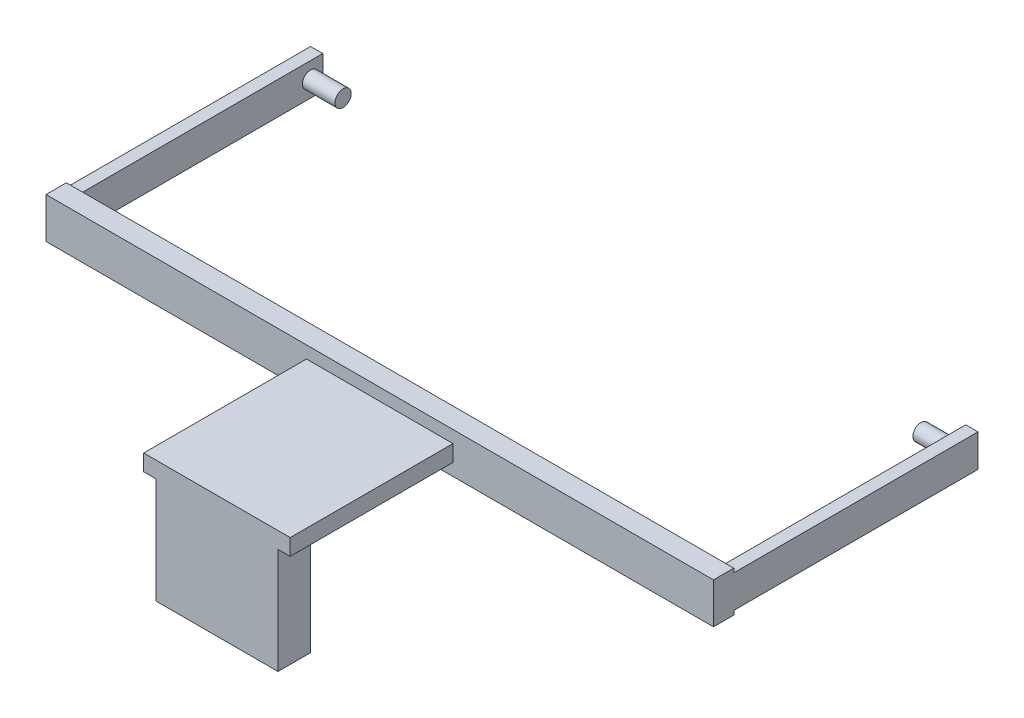
ISO-10303-21;
HEADER;
FILE_DESCRIPTION(('STEP AP214'),'2;1');
FILE_NAME('part.step','',(''),(''),'','','');
FILE_SCHEMA(('AUTOMOTIVE_DESIGN { 1 0 10303 214 1 1 1 1 }'));
ENDSEC;
DATA;
#1=APPLICATION_CONTEXT('core data for automotive mechanical design processes');
#2=APPLICATION_PROTOCOL_DEFINITION('international standard','automotive_design',2000,#1);
#3=PRODUCT_CONTEXT('',#1,'mechanical');
#4=PRODUCT('Part','Part','',(#3));
#5=PRODUCT_RELATED_PRODUCT_CATEGORY('part','',(#4));
#6=PRODUCT_DEFINITION_FORMATION('','',#4);
#7=PRODUCT_DEFINITION_CONTEXT('part definition',#1,'design');
#8=PRODUCT_DEFINITION('design','',#6,#7);
#9=PRODUCT_DEFINITION_SHAPE('','',#8);
#10=(LENGTH_UNIT() NAMED_UNIT(*) SI_UNIT(.MILLI.,.METRE.));
#11=(NAMED_UNIT(*) PLANE_ANGLE_UNIT() SI_UNIT($,.RADIAN.));
#12=(NAMED_UNIT(*) SI_UNIT($,.STERADIAN.) SOLID_ANGLE_UNIT());
#13=UNCERTAINTY_MEASURE_WITH_UNIT(LENGTH_MEASURE(1.E-05),#10,'distance_accuracy_value','');
#14=(GEOMETRIC_REPRESENTATION_CONTEXT(3) GLOBAL_UNCERTAINTY_ASSIGNED_CONTEXT((#13)) GLOBAL_UNIT_ASSIGNED_CONTEXT((#10,
#11,#12)) REPRESENTATION_CONTEXT('',''));
#15=CARTESIAN_POINT('',(0.,0.,0.));
#16=DIRECTION('',(0.,0.,1.));
#17=DIRECTION('',(1.,0.,0.));
#18=AXIS2_PLACEMENT_3D('',#15,#16,#17);
#19=CARTESIAN_POINT('',(-18.,3.,42.5));
#20=DIRECTION('',(0.,1.,0.));
#21=DIRECTION('',(0.,0.,1.));
#22=AXIS2_PLACEMENT_3D('',#19,#20,#21);
#23=PLANE('',#22);
#24=DIRECTION('',(0.,0.,-1.));
#25=VECTOR('',#24,1.);
#26=CARTESIAN_POINT('',(-15.,3.,34.5));
#27=LINE('',#26,#25);
#28=CARTESIAN_POINT('',(-15.,3.,42.5));
#29=VERTEX_POINT('',#28);
#30=CARTESIAN_POINT('',(-15.,3.,34.5));
#31=VERTEX_POINT('',#30);
#32=EDGE_CURVE('E205',#29,#31,#27,.T.);
#33=ORIENTED_EDGE('',*,*,#32,.F.);
#34=DIRECTION('',(1.,0.,0.));
#35=VECTOR('',#34,1.);
#36=CARTESIAN_POINT('',(-18.,3.,42.5));
#37=LINE('',#36,#35);
#38=CARTESIAN_POINT('',(-18.,3.,42.5));
#39=VERTEX_POINT('',#38);
#40=EDGE_CURVE('E222',#39,#29,#37,.T.);
#41=ORIENTED_EDGE('',*,*,#40,.F.);
#42=DIRECTION('',(0.,0.,-1.));
#43=VECTOR('',#42,1.);
#44=CARTESIAN_POINT('',(-18.,3.,42.5));
#45=LINE('',#44,#43);
#46=CARTESIAN_POINT('',(-18.,3.,2.5));
#47=VERTEX_POINT('',#46);
#48=EDGE_CURVE('E234',#39,#47,#45,.T.);
#49=ORIENTED_EDGE('',*,*,#48,.T.);
#50=DIRECTION('',(1.,0.,0.));
#51=VECTOR('',#50,1.);
#52=CARTESIAN_POINT('',(-18.,3.,2.5));
#53=LINE('',#52,#51);
#54=CARTESIAN_POINT('',(18.,3.,2.5));
#55=VERTEX_POINT('',#54);
#56=EDGE_CURVE('E217',#47,#55,#53,.T.);
#57=ORIENTED_EDGE('',*,*,#56,.T.);
#58=DIRECTION('',(0.,0.,-1.));
#59=VECTOR('',#58,1.);
#60=CARTESIAN_POINT('',(18.,3.,42.5));
#61=LINE('',#60,#59);
#62=CARTESIAN_POINT('',(18.,3.,42.5));
#63=VERTEX_POINT('',#62);
#64=EDGE_CURVE('E224',#63,#55,#61,.T.);
#65=ORIENTED_EDGE('',*,*,#64,.F.);
#66=CARTESIAN_POINT('',(15.,3.,42.5));
#67=VERTEX_POINT('',#66);
#68=EDGE_CURVE('E221',#67,#63,#37,.T.);
#69=ORIENTED_EDGE('',*,*,#68,.F.);
#70=DIRECTION('',(0.,0.,1.));
#71=VECTOR('',#70,1.);
#72=CARTESIAN_POINT('',(15.,3.,34.5));
#73=LINE('',#72,#71);
#74=CARTESIAN_POINT('',(15.,3.,34.5));
#75=VERTEX_POINT('',#74);
#76=EDGE_CURVE('E201',#75,#67,#73,.T.);
#77=ORIENTED_EDGE('',*,*,#76,.F.);
#78=DIRECTION('',(1.,0.,0.));
#79=VECTOR('',#78,1.);
#80=CARTESIAN_POINT('',(15.,3.,34.5));
#81=LINE('',#80,#79);
#82=EDGE_CURVE('E528',#31,#75,#81,.T.);
#83=ORIENTED_EDGE('',*,*,#82,.F.);
#84=EDGE_LOOP('',(#33,#41,#49,#57,#65,#69,#77,#83));
#85=FACE_BOUND('',#84,.T.);
#86=ADVANCED_FACE('F46',(#85),#23,.F.);
#87=CARTESIAN_POINT('',(-82.,10.,2.5));
#88=DIRECTION('',(0.,0.,-1.));
#89=DIRECTION('',(-1.,0.,0.));
#90=AXIS2_PLACEMENT_3D('',#87,#88,#89);
#91=PLANE('',#90);
#92=DIRECTION('',(1.,0.,0.));
#93=VECTOR('',#92,1.);
#94=CARTESIAN_POINT('',(-82.,0.,2.5));
#95=LINE('',#94,#93);
#96=CARTESIAN_POINT('',(-82.,0.,2.5));
#97=VERTEX_POINT('',#96);
#98=CARTESIAN_POINT('',(82.,0.,2.5));
#99=VERTEX_POINT('',#98);
#100=EDGE_CURVE('E310',#97,#99,#95,.T.);
#101=ORIENTED_EDGE('',*,*,#100,.T.);
#102=DIRECTION('',(0.,-1.,0.));
#103=VECTOR('',#102,1.);
#104=CARTESIAN_POINT('',(82.,10.,2.5));
#105=LINE('',#104,#103);
#106=CARTESIAN_POINT('',(82.,10.,2.5));
#107=VERTEX_POINT('',#106);
#108=EDGE_CURVE('E316',#107,#99,#105,.T.);
#109=ORIENTED_EDGE('',*,*,#108,.F.);
#110=DIRECTION('',(1.,0.,0.));
#111=VECTOR('',#110,1.);
#112=CARTESIAN_POINT('',(-82.,10.,2.5));
#113=LINE('',#112,#111);
#114=CARTESIAN_POINT('',(-82.,10.,2.5));
#115=VERTEX_POINT('',#114);
#116=EDGE_CURVE('E314',#115,#107,#113,.T.);
#117=ORIENTED_EDGE('',*,*,#116,.F.);
#118=DIRECTION('',(0.,-1.,0.));
#119=VECTOR('',#118,1.);
#120=CARTESIAN_POINT('',(-82.,10.,2.5));
#121=LINE('',#120,#119);
#122=EDGE_CURVE('E327',#115,#97,#121,.T.);
#123=ORIENTED_EDGE('',*,*,#122,.T.);
#124=EDGE_LOOP('',(#101,#109,#117,#123));
#125=FACE_BOUND('',#124,.T.);
#126=DIRECTION('',(0.,1.,0.));
#127=VECTOR('',#126,1.);
#128=CARTESIAN_POINT('',(18.,7.,2.5));
#129=LINE('',#128,#127);
#130=CARTESIAN_POINT('',(18.,7.,2.5));
#131=VERTEX_POINT('',#130);
#132=EDGE_CURVE('E69',#55,#131,#129,.T.);
#133=ORIENTED_EDGE('',*,*,#132,.F.);
#134=ORIENTED_EDGE('',*,*,#56,.F.);
#135=DIRECTION('',(0.,-1.,0.));
#136=VECTOR('',#135,1.);
#137=CARTESIAN_POINT('',(-18.,7.,2.5));
#138=LINE('',#137,#136);
#139=CARTESIAN_POINT('',(-18.,7.,2.5));
#140=VERTEX_POINT('',#139);
#141=EDGE_CURVE('E228',#140,#47,#138,.T.);
#142=ORIENTED_EDGE('',*,*,#141,.F.);
#143=DIRECTION('',(-1.,0.,0.));
#144=VECTOR('',#143,1.);
#145=CARTESIAN_POINT('',(-18.,7.,2.5));
#146=LINE('',#145,#144);
#147=EDGE_CURVE('E208',#131,#140,#146,.T.);
#148=ORIENTED_EDGE('',*,*,#147,.F.);
#149=EDGE_LOOP('',(#133,#134,#142,#148));
#150=FACE_BOUND('',#149,.T.);
#151=ADVANCED_FACE('F403',(#125,#150),#91,.F.);
#152=CARTESIAN_POINT('',(-82.,10.,-2.5));
#153=DIRECTION('',(0.,0.,1.));
#154=DIRECTION('',(1.,0.,0.));
#155=AXIS2_PLACEMENT_3D('',#152,#153,#154);
#156=PLANE('',#155);
#157=DIRECTION('',(1.,0.,0.));
#158=VECTOR('',#157,1.);
#159=CARTESIAN_POINT('',(-79.,9.00000000000001,-2.5));
#160=LINE('',#159,#158);
#161=CARTESIAN_POINT('',(-82.,9.00000000000001,-2.5));
#162=VERTEX_POINT('',#161);
#163=CARTESIAN_POINT('',(-79.,9.00000000000001,-2.5));
#164=VERTEX_POINT('',#163);
#165=EDGE_CURVE('E249',#162,#164,#160,.T.);
#166=ORIENTED_EDGE('',*,*,#165,.F.);
#167=DIRECTION('',(0.,-1.,0.));
#168=VECTOR('',#167,1.);
#169=CARTESIAN_POINT('',(-82.,10.,-2.5));
#170=LINE('',#169,#168);
#171=CARTESIAN_POINT('',(-82.,10.,-2.5));
#172=VERTEX_POINT('',#171);
#173=EDGE_CURVE('E331',#172,#162,#170,.T.);
#174=ORIENTED_EDGE('',*,*,#173,.F.);
#175=DIRECTION('',(-1.,0.,0.));
#176=VECTOR('',#175,1.);
#177=CARTESIAN_POINT('',(-82.,10.,-2.5));
#178=LINE('',#177,#176);
#179=CARTESIAN_POINT('',(82.,10.,-2.5));
#180=VERTEX_POINT('',#179);
#181=EDGE_CURVE('E309',#180,#172,#178,.T.);
#182=ORIENTED_EDGE('',*,*,#181,.F.);
#183=DIRECTION('',(0.,-1.,0.));
#184=VECTOR('',#183,1.);
#185=CARTESIAN_POINT('',(82.,10.,-2.5));
#186=LINE('',#185,#184);
#187=CARTESIAN_POINT('',(82.,9.,-2.5));
#188=VERTEX_POINT('',#187);
#189=EDGE_CURVE('E335',#180,#188,#186,.T.);
#190=ORIENTED_EDGE('',*,*,#189,.T.);
#191=DIRECTION('',(1.,0.,0.));
#192=VECTOR('',#191,1.);
#193=CARTESIAN_POINT('',(82.,9.,-2.5));
#194=LINE('',#193,#192);
#195=CARTESIAN_POINT('',(79.,9.,-2.5));
#196=VERTEX_POINT('',#195);
#197=EDGE_CURVE('E289',#196,#188,#194,.T.);
#198=ORIENTED_EDGE('',*,*,#197,.F.);
#199=DIRECTION('',(0.,1.,0.));
#200=VECTOR('',#199,1.);
#201=CARTESIAN_POINT('',(79.,1.,-2.5));
#202=LINE('',#201,#200);
#203=CARTESIAN_POINT('',(79.,1.,-2.5));
#204=VERTEX_POINT('',#203);
#205=EDGE_CURVE('E275',#204,#196,#202,.T.);
#206=ORIENTED_EDGE('',*,*,#205,.F.);
#207=DIRECTION('',(-1.,0.,0.));
#208=VECTOR('',#207,1.);
#209=CARTESIAN_POINT('',(82.,1.,-2.5));
#210=LINE('',#209,#208);
#211=CARTESIAN_POINT('',(82.,1.,-2.5));
#212=VERTEX_POINT('',#211);
#213=EDGE_CURVE('E280',#212,#204,#210,.T.);
#214=ORIENTED_EDGE('',*,*,#213,.F.);
#215=CARTESIAN_POINT('',(82.,0.,-2.5));
#216=VERTEX_POINT('',#215);
#217=EDGE_CURVE('E334',#212,#216,#186,.T.);
#218=ORIENTED_EDGE('',*,*,#217,.T.);
#219=DIRECTION('',(-1.,0.,0.));
#220=VECTOR('',#219,1.);
#221=CARTESIAN_POINT('',(-82.,0.,-2.5));
#222=LINE('',#221,#220);
#223=CARTESIAN_POINT('',(-82.,0.,-2.5));
#224=VERTEX_POINT('',#223);
#225=EDGE_CURVE('E319',#216,#224,#222,.T.);
#226=ORIENTED_EDGE('',*,*,#225,.T.);
#227=CARTESIAN_POINT('',(-82.,1.,-2.5));
#228=VERTEX_POINT('',#227);
#229=EDGE_CURVE('E330',#228,#224,#170,.T.);
#230=ORIENTED_EDGE('',*,*,#229,.F.);
#231=DIRECTION('',(-1.,0.,0.));
#232=VECTOR('',#231,1.);
#233=CARTESIAN_POINT('',(-79.,1.,-2.5));
#234=LINE('',#233,#232);
#235=CARTESIAN_POINT('',(-79.,1.,-2.5));
#236=VERTEX_POINT('',#235);
#237=EDGE_CURVE('E254',#236,#228,#234,.T.);
#238=ORIENTED_EDGE('',*,*,#237,.F.);
#239=DIRECTION('',(0.,-1.,0.));
#240=VECTOR('',#239,1.);
#241=CARTESIAN_POINT('',(-79.,1.,-2.5));
#242=LINE('',#241,#240);
#243=EDGE_CURVE('E262',#164,#236,#242,.T.);
#244=ORIENTED_EDGE('',*,*,#243,.F.);
#245=EDGE_LOOP('',(#166,#174,#182,#190,#198,#206,#214,#218,#226,#230,#238,#244));
#246=FACE_BOUND('',#245,.T.);
#247=ADVANCED_FACE('F358',(#246),#156,.F.);
#248=CARTESIAN_POINT('',(82.,10.,-2.5));
#249=DIRECTION('',(-1.,0.,0.));
#250=DIRECTION('',(0.,0.,1.));
#251=AXIS2_PLACEMENT_3D('',#248,#249,#250);
#252=PLANE('',#251);
#253=DIRECTION('',(0.,0.,-1.));
#254=VECTOR('',#253,1.);
#255=CARTESIAN_POINT('',(82.,0.,-2.5));
#256=LINE('',#255,#254);
#257=EDGE_CURVE('E305',#99,#216,#256,.T.);
#258=ORIENTED_EDGE('',*,*,#257,.T.);
#259=ORIENTED_EDGE('',*,*,#217,.F.);
#260=DIRECTION('',(0.,0.,1.));
#261=VECTOR('',#260,1.);
#262=CARTESIAN_POINT('',(82.,1.,-62.5));
#263=LINE('',#262,#261);
#264=CARTESIAN_POINT('',(82.,1.,-62.5));
#265=VERTEX_POINT('',#264);
#266=EDGE_CURVE('E296',#265,#212,#263,.T.);
#267=ORIENTED_EDGE('',*,*,#266,.F.);
#268=DIRECTION('',(0.,-1.,0.));
#269=VECTOR('',#268,1.);
#270=CARTESIAN_POINT('',(82.,1.,-62.5));
#271=LINE('',#270,#269);
#272=CARTESIAN_POINT('',(82.,9.,-62.5));
#273=VERTEX_POINT('',#272);
#274=EDGE_CURVE('E282',#273,#265,#271,.T.);
#275=ORIENTED_EDGE('',*,*,#274,.F.);
#276=DIRECTION('',(0.,0.,1.));
#277=VECTOR('',#276,1.);
#278=CARTESIAN_POINT('',(82.,9.,-62.5));
#279=LINE('',#278,#277);
#280=EDGE_CURVE('E299',#273,#188,#279,.T.);
#281=ORIENTED_EDGE('',*,*,#280,.T.);
#282=ORIENTED_EDGE('',*,*,#189,.F.);
#283=DIRECTION('',(0.,0.,-1.));
#284=VECTOR('',#283,1.);
#285=CARTESIAN_POINT('',(82.,10.,-2.5));
#286=LINE('',#285,#284);
#287=EDGE_CURVE('E306',#107,#180,#286,.T.);
#288=ORIENTED_EDGE('',*,*,#287,.F.);
#289=ORIENTED_EDGE('',*,*,#108,.T.);
#290=EDGE_LOOP('',(#258,#259,#267,#275,#281,#282,#288,#289));
#291=FACE_BOUND('',#290,.T.);
#292=ADVANCED_FACE('F48',(#291),#252,.F.);
#293=CARTESIAN_POINT('',(-82.,10.,-2.5));
#294=DIRECTION('',(1.,0.,0.));
#295=DIRECTION('',(0.,0.,-1.));
#296=AXIS2_PLACEMENT_3D('',#293,#294,#295);
#297=PLANE('',#296);
#298=DIRECTION('',(0.,0.,1.));
#299=VECTOR('',#298,1.);
#300=CARTESIAN_POINT('',(-82.,0.,-2.5));
#301=LINE('',#300,#299);
#302=EDGE_CURVE('E322',#224,#97,#301,.T.);
#303=ORIENTED_EDGE('',*,*,#302,.T.);
#304=ORIENTED_EDGE('',*,*,#122,.F.);
#305=DIRECTION('',(0.,0.,1.));
#306=VECTOR('',#305,1.);
#307=CARTESIAN_POINT('',(-82.,10.,-2.5));
#308=LINE('',#307,#306);
#309=EDGE_CURVE('E312',#172,#115,#308,.T.);
#310=ORIENTED_EDGE('',*,*,#309,.F.);
#311=ORIENTED_EDGE('',*,*,#173,.T.);
#312=DIRECTION('',(0.,0.,1.));
#313=VECTOR('',#312,1.);
#314=CARTESIAN_POINT('',(-82.,9.,-62.5));
#315=LINE('',#314,#313);
#316=CARTESIAN_POINT('',(-82.,9.,-62.5));
#317=VERTEX_POINT('',#316);
#318=EDGE_CURVE('E273',#317,#162,#315,.T.);
#319=ORIENTED_EDGE('',*,*,#318,.F.);
#320=DIRECTION('',(0.,1.,0.));
#321=VECTOR('',#320,1.);
#322=CARTESIAN_POINT('',(-82.,1.,-62.5));
#323=LINE('',#322,#321);
#324=CARTESIAN_POINT('',(-82.,1.,-62.5));
#325=VERTEX_POINT('',#324);
#326=EDGE_CURVE('E250',#325,#317,#323,.T.);
#327=ORIENTED_EDGE('',*,*,#326,.F.);
#328=DIRECTION('',(0.,0.,1.));
#329=VECTOR('',#328,1.);
#330=CARTESIAN_POINT('',(-82.,1.,-62.5));
#331=LINE('',#330,#329);
#332=EDGE_CURVE('E260',#325,#228,#331,.T.);
#333=ORIENTED_EDGE('',*,*,#332,.T.);
#334=ORIENTED_EDGE('',*,*,#229,.T.);
#335=EDGE_LOOP('',(#303,#304,#310,#311,#319,#327,#333,#334));
#336=FACE_BOUND('',#335,.T.);
#337=ADVANCED_FACE('F362',(#336),#297,.F.);
#338=CARTESIAN_POINT('',(0.,10.,0.));
#339=DIRECTION('',(0.,1.,0.));
#340=DIRECTION('',(0.,0.,1.));
#341=AXIS2_PLACEMENT_3D('',#338,#339,#340);
#342=PLANE('',#341);
#343=ORIENTED_EDGE('',*,*,#287,.T.);
#344=ORIENTED_EDGE('',*,*,#181,.T.);
#345=ORIENTED_EDGE('',*,*,#309,.T.);
#346=ORIENTED_EDGE('',*,*,#116,.T.);
#347=EDGE_LOOP('',(#343,#344,#345,#346));
#348=FACE_BOUND('',#347,.T.);
#349=ADVANCED_FACE('F373',(#348),#342,.T.);
#350=CARTESIAN_POINT('',(0.,0.,0.));
#351=DIRECTION('',(0.,1.,0.));
#352=DIRECTION('',(0.,0.,1.));
#353=AXIS2_PLACEMENT_3D('',#350,#351,#352);
#354=PLANE('',#353);
#355=ORIENTED_EDGE('',*,*,#257,.F.);
#356=ORIENTED_EDGE('',*,*,#100,.F.);
#357=ORIENTED_EDGE('',*,*,#302,.F.);
#358=ORIENTED_EDGE('',*,*,#225,.F.);
#359=EDGE_LOOP('',(#355,#356,#357,#358));
#360=FACE_BOUND('',#359,.T.);
#361=ADVANCED_FACE('F573',(#360),#354,.F.);
#362=CARTESIAN_POINT('',(79.,1.,-62.5));
#363=DIRECTION('',(1.,0.,0.));
#364=DIRECTION('',(0.,0.,-1.));
#365=AXIS2_PLACEMENT_3D('',#362,#363,#364);
#366=PLANE('',#365);
#367=CARTESIAN_POINT('',(79.,5.,-59.5));
#368=DIRECTION('',(1.,0.,0.));
#369=DIRECTION('',(0.,0.,-1.));
#370=AXIS2_PLACEMENT_3D('',#367,#368,#369);
#371=CIRCLE('',#370,2.);
#372=CARTESIAN_POINT('',(79.,5.,-61.5));
#373=VERTEX_POINT('',#372);
#374=EDGE_CURVE('E13',#373,#373,#371,.F.);
#375=ORIENTED_EDGE('',*,*,#374,.F.);
#376=EDGE_LOOP('',(#375));
#377=FACE_BOUND('',#376,.T.);
#378=ORIENTED_EDGE('',*,*,#205,.T.);
#379=DIRECTION('',(0.,0.,1.));
#380=VECTOR('',#379,1.);
#381=CARTESIAN_POINT('',(79.,9.,-62.5));
#382=LINE('',#381,#380);
#383=CARTESIAN_POINT('',(79.,9.,-62.5));
#384=VERTEX_POINT('',#383);
#385=EDGE_CURVE('E302',#384,#196,#382,.T.);
#386=ORIENTED_EDGE('',*,*,#385,.F.);
#387=DIRECTION('',(0.,1.,0.));
#388=VECTOR('',#387,1.);
#389=CARTESIAN_POINT('',(79.,1.,-62.5));
#390=LINE('',#389,#388);
#391=CARTESIAN_POINT('',(79.,1.,-62.5));
#392=VERTEX_POINT('',#391);
#393=EDGE_CURVE('E276',#392,#384,#390,.T.);
#394=ORIENTED_EDGE('',*,*,#393,.F.);
#395=DIRECTION('',(0.,0.,1.));
#396=VECTOR('',#395,1.);
#397=CARTESIAN_POINT('',(79.,1.,-62.5));
#398=LINE('',#397,#396);
#399=EDGE_CURVE('E286',#392,#204,#398,.T.);
#400=ORIENTED_EDGE('',*,*,#399,.T.);
#401=EDGE_LOOP('',(#378,#386,#394,#400));
#402=FACE_BOUND('',#401,.T.);
#403=ADVANCED_FACE('F391',(#377,#402),#366,.F.);
#404=CARTESIAN_POINT('',(82.,9.,-62.5));
#405=DIRECTION('',(0.,-1.,0.));
#406=DIRECTION('',(0.,0.,-1.));
#407=AXIS2_PLACEMENT_3D('',#404,#405,#406);
#408=PLANE('',#407);
#409=ORIENTED_EDGE('',*,*,#197,.T.);
#410=ORIENTED_EDGE('',*,*,#280,.F.);
#411=DIRECTION('',(1.,0.,0.));
#412=VECTOR('',#411,1.);
#413=CARTESIAN_POINT('',(82.,9.,-62.5));
#414=LINE('',#413,#412);
#415=EDGE_CURVE('E279',#384,#273,#414,.T.);
#416=ORIENTED_EDGE('',*,*,#415,.F.);
#417=ORIENTED_EDGE('',*,*,#385,.T.);
#418=EDGE_LOOP('',(#409,#410,#416,#417));
#419=FACE_BOUND('',#418,.T.);
#420=ADVANCED_FACE('F380',(#419),#408,.F.);
#421=CARTESIAN_POINT('',(82.,1.,-62.5));
#422=DIRECTION('',(0.,1.,0.));
#423=DIRECTION('',(-1.,0.,0.));
#424=AXIS2_PLACEMENT_3D('',#421,#422,#423);
#425=PLANE('',#424);
#426=ORIENTED_EDGE('',*,*,#213,.T.);
#427=ORIENTED_EDGE('',*,*,#399,.F.);
#428=DIRECTION('',(-1.,0.,0.));
#429=VECTOR('',#428,1.);
#430=CARTESIAN_POINT('',(82.,1.,-62.5));
#431=LINE('',#430,#429);
#432=EDGE_CURVE('E284',#265,#392,#431,.T.);
#433=ORIENTED_EDGE('',*,*,#432,.F.);
#434=ORIENTED_EDGE('',*,*,#266,.T.);
#435=EDGE_LOOP('',(#426,#427,#433,#434));
#436=FACE_BOUND('',#435,.T.);
#437=ADVANCED_FACE('F393',(#436),#425,.F.);
#438=CARTESIAN_POINT('',(0.,0.,-62.5));
#439=DIRECTION('',(0.,0.,1.));
#440=DIRECTION('',(1.,0.,0.));
#441=AXIS2_PLACEMENT_3D('',#438,#439,#440);
#442=PLANE('',#441);
#443=ORIENTED_EDGE('',*,*,#393,.T.);
#444=ORIENTED_EDGE('',*,*,#415,.T.);
#445=ORIENTED_EDGE('',*,*,#274,.T.);
#446=ORIENTED_EDGE('',*,*,#432,.T.);
#447=EDGE_LOOP('',(#443,#444,#445,#446));
#448=FACE_BOUND('',#447,.T.);
#449=ADVANCED_FACE('F387',(#448),#442,.F.);
#450=CARTESIAN_POINT('',(-79.,9.,-62.5));
#451=DIRECTION('',(0.,-1.,0.));
#452=DIRECTION('',(0.,0.,-1.));
#453=AXIS2_PLACEMENT_3D('',#450,#451,#452);
#454=PLANE('',#453);
#455=ORIENTED_EDGE('',*,*,#165,.T.);
#456=DIRECTION('',(0.,0.,1.));
#457=VECTOR('',#456,1.);
#458=CARTESIAN_POINT('',(-79.,9.,-62.5));
#459=LINE('',#458,#457);
#460=CARTESIAN_POINT('',(-79.,9.,-62.5));
#461=VERTEX_POINT('',#460);
#462=EDGE_CURVE('E270',#461,#164,#459,.T.);
#463=ORIENTED_EDGE('',*,*,#462,.F.);
#464=DIRECTION('',(1.,0.,0.));
#465=VECTOR('',#464,1.);
#466=CARTESIAN_POINT('',(-79.,9.,-62.5));
#467=LINE('',#466,#465);
#468=EDGE_CURVE('E253',#317,#461,#467,.T.);
#469=ORIENTED_EDGE('',*,*,#468,.F.);
#470=ORIENTED_EDGE('',*,*,#318,.T.);
#471=EDGE_LOOP('',(#455,#463,#469,#470));
#472=FACE_BOUND('',#471,.T.);
#473=ADVANCED_FACE('F345',(#472),#454,.F.);
#474=CARTESIAN_POINT('',(-79.,1.,-62.5));
#475=DIRECTION('',(-1.,0.,0.));
#476=DIRECTION('',(0.,0.,1.));
#477=AXIS2_PLACEMENT_3D('',#474,#475,#476);
#478=PLANE('',#477);
#479=CARTESIAN_POINT('',(-79.,5.,-59.5));
#480=DIRECTION('',(-1.,0.,0.));
#481=DIRECTION('',(0.,0.,1.));
#482=AXIS2_PLACEMENT_3D('',#479,#480,#481);
#483=CIRCLE('',#482,2.);
#484=CARTESIAN_POINT('',(-79.,5.,-57.5));
#485=VERTEX_POINT('',#484);
#486=EDGE_CURVE('E54',#485,#485,#483,.F.);
#487=ORIENTED_EDGE('',*,*,#486,.F.);
#488=EDGE_LOOP('',(#487));
#489=FACE_BOUND('',#488,.T.);
#490=ORIENTED_EDGE('',*,*,#243,.T.);
#491=DIRECTION('',(0.,0.,1.));
#492=VECTOR('',#491,1.);
#493=CARTESIAN_POINT('',(-79.,1.,-62.5));
#494=LINE('',#493,#492);
#495=CARTESIAN_POINT('',(-79.,1.,-62.5));
#496=VERTEX_POINT('',#495);
#497=EDGE_CURVE('E267',#496,#236,#494,.T.);
#498=ORIENTED_EDGE('',*,*,#497,.F.);
#499=DIRECTION('',(0.,-1.,0.));
#500=VECTOR('',#499,1.);
#501=CARTESIAN_POINT('',(-79.,1.,-62.5));
#502=LINE('',#501,#500);
#503=EDGE_CURVE('E256',#461,#496,#502,.T.);
#504=ORIENTED_EDGE('',*,*,#503,.F.);
#505=ORIENTED_EDGE('',*,*,#462,.T.);
#506=EDGE_LOOP('',(#490,#498,#504,#505));
#507=FACE_BOUND('',#506,.T.);
#508=ADVANCED_FACE('F341',(#489,#507),#478,.F.);
#509=CARTESIAN_POINT('',(-79.,1.,-62.5));
#510=DIRECTION('',(0.,1.,0.));
#511=DIRECTION('',(-1.,0.,0.));
#512=AXIS2_PLACEMENT_3D('',#509,#510,#511);
#513=PLANE('',#512);
#514=ORIENTED_EDGE('',*,*,#237,.T.);
#515=ORIENTED_EDGE('',*,*,#332,.F.);
#516=DIRECTION('',(-1.,0.,0.));
#517=VECTOR('',#516,1.);
#518=CARTESIAN_POINT('',(-79.,1.,-62.5));
#519=LINE('',#518,#517);
#520=EDGE_CURVE('E258',#496,#325,#519,.T.);
#521=ORIENTED_EDGE('',*,*,#520,.F.);
#522=ORIENTED_EDGE('',*,*,#497,.T.);
#523=EDGE_LOOP('',(#514,#515,#521,#522));
#524=FACE_BOUND('',#523,.T.);
#525=ADVANCED_FACE('F344',(#524),#513,.F.);
#526=CARTESIAN_POINT('',(-161.,0.,-62.5));
#527=DIRECTION('',(0.,0.,1.));
#528=DIRECTION('',(1.,0.,0.));
#529=AXIS2_PLACEMENT_3D('',#526,#527,#528);
#530=PLANE('',#529);
#531=ORIENTED_EDGE('',*,*,#326,.T.);
#532=ORIENTED_EDGE('',*,*,#468,.T.);
#533=ORIENTED_EDGE('',*,*,#503,.T.);
#534=ORIENTED_EDGE('',*,*,#520,.T.);
#535=EDGE_LOOP('',(#531,#532,#533,#534));
#536=FACE_BOUND('',#535,.T.);
#537=ADVANCED_FACE('F367',(#536),#530,.F.);
#538=CARTESIAN_POINT('',(-71.,5.,-59.5));
#539=DIRECTION('',(-1.,0.,0.));
#540=DIRECTION('',(0.,0.,1.));
#541=AXIS2_PLACEMENT_3D('',#538,#539,#540);
#542=CYLINDRICAL_SURFACE('',#541,2.);
#543=CARTESIAN_POINT('',(-71.,5.,-59.5));
#544=DIRECTION('',(1.,0.,0.));
#545=DIRECTION('',(0.,0.,-1.));
#546=AXIS2_PLACEMENT_3D('',#543,#544,#545);
#547=CIRCLE('',#546,2.);
#548=CARTESIAN_POINT('',(-71.,5.,-61.5));
#549=VERTEX_POINT('',#548);
#550=EDGE_CURVE('E246',#549,#549,#547,.T.);
#551=ORIENTED_EDGE('',*,*,#550,.F.);
#552=EDGE_LOOP('',(#551));
#553=FACE_BOUND('',#552,.T.);
#554=ORIENTED_EDGE('',*,*,#486,.T.);
#555=EDGE_LOOP('',(#554));
#556=FACE_BOUND('',#555,.T.);
#557=ADVANCED_FACE('F339',(#553,#556),#542,.T.);
#558=CARTESIAN_POINT('',(-71.,5.,-59.5));
#559=DIRECTION('',(1.,0.,0.));
#560=DIRECTION('',(0.,0.,-1.));
#561=AXIS2_PLACEMENT_3D('',#558,#559,#560);
#562=PLANE('',#561);
#563=ORIENTED_EDGE('',*,*,#550,.T.);
#564=EDGE_LOOP('',(#563));
#565=FACE_BOUND('',#564,.T.);
#566=ADVANCED_FACE('F434',(#565),#562,.T.);
#567=CARTESIAN_POINT('',(71.,5.,-59.5));
#568=DIRECTION('',(1.,0.,0.));
#569=DIRECTION('',(0.,0.,-1.));
#570=AXIS2_PLACEMENT_3D('',#567,#568,#569);
#571=CYLINDRICAL_SURFACE('',#570,2.);
#572=CARTESIAN_POINT('',(71.,5.,-59.5));
#573=DIRECTION('',(-1.,0.,0.));
#574=DIRECTION('',(0.,0.,1.));
#575=AXIS2_PLACEMENT_3D('',#572,#573,#574);
#576=CIRCLE('',#575,2.);
#577=CARTESIAN_POINT('',(71.,5.,-57.5));
#578=VERTEX_POINT('',#577);
#579=EDGE_CURVE('E243',#578,#578,#576,.T.);
#580=ORIENTED_EDGE('',*,*,#579,.F.);
#581=EDGE_LOOP('',(#580));
#582=FACE_BOUND('',#581,.T.);
#583=ORIENTED_EDGE('',*,*,#374,.T.);
#584=EDGE_LOOP('',(#583));
#585=FACE_BOUND('',#584,.T.);
#586=ADVANCED_FACE('F430',(#582,#585),#571,.T.);
#587=CARTESIAN_POINT('',(71.,5.,-59.5));
#588=DIRECTION('',(-1.,0.,0.));
#589=DIRECTION('',(0.,0.,1.));
#590=AXIS2_PLACEMENT_3D('',#587,#588,#589);
#591=PLANE('',#590);
#592=ORIENTED_EDGE('',*,*,#579,.T.);
#593=EDGE_LOOP('',(#592));
#594=FACE_BOUND('',#593,.T.);
#595=ADVANCED_FACE('F426',(#594),#591,.T.);
#596=CARTESIAN_POINT('',(18.,7.,42.5));
#597=DIRECTION('',(-1.,0.,0.));
#598=DIRECTION('',(0.,0.,1.));
#599=AXIS2_PLACEMENT_3D('',#596,#597,#598);
#600=PLANE('',#599);
#601=ORIENTED_EDGE('',*,*,#132,.T.);
#602=DIRECTION('',(0.,0.,-1.));
#603=VECTOR('',#602,1.);
#604=CARTESIAN_POINT('',(18.,7.,42.5));
#605=LINE('',#604,#603);
#606=CARTESIAN_POINT('',(18.,7.,42.5));
#607=VERTEX_POINT('',#606);
#608=EDGE_CURVE('E240',#607,#131,#605,.T.);
#609=ORIENTED_EDGE('',*,*,#608,.F.);
#610=DIRECTION('',(0.,1.,0.));
#611=VECTOR('',#610,1.);
#612=CARTESIAN_POINT('',(18.,7.,42.5));
#613=LINE('',#612,#611);
#614=EDGE_CURVE('E213',#63,#607,#613,.T.);
#615=ORIENTED_EDGE('',*,*,#614,.F.);
#616=ORIENTED_EDGE('',*,*,#64,.T.);
#617=EDGE_LOOP('',(#601,#609,#615,#616));
#618=FACE_BOUND('',#617,.T.);
#619=ADVANCED_FACE('F422',(#618),#600,.F.);
#620=CARTESIAN_POINT('',(-18.,7.,42.5));
#621=DIRECTION('',(0.,-1.,0.));
#622=DIRECTION('',(0.,0.,-1.));
#623=AXIS2_PLACEMENT_3D('',#620,#621,#622);
#624=PLANE('',#623);
#625=ORIENTED_EDGE('',*,*,#147,.T.);
#626=DIRECTION('',(0.,0.,-1.));
#627=VECTOR('',#626,1.);
#628=CARTESIAN_POINT('',(-18.,7.,42.5));
#629=LINE('',#628,#627);
#630=CARTESIAN_POINT('',(-18.,7.,42.5));
#631=VERTEX_POINT('',#630);
#632=EDGE_CURVE('E237',#631,#140,#629,.T.);
#633=ORIENTED_EDGE('',*,*,#632,.F.);
#634=DIRECTION('',(-1.,0.,0.));
#635=VECTOR('',#634,1.);
#636=CARTESIAN_POINT('',(-18.,7.,42.5));
#637=LINE('',#636,#635);
#638=EDGE_CURVE('E216',#607,#631,#637,.T.);
#639=ORIENTED_EDGE('',*,*,#638,.F.);
#640=ORIENTED_EDGE('',*,*,#608,.T.);
#641=EDGE_LOOP('',(#625,#633,#639,#640));
#642=FACE_BOUND('',#641,.T.);
#643=ADVANCED_FACE('F418',(#642),#624,.F.);
#644=CARTESIAN_POINT('',(-18.,7.,42.5));
#645=DIRECTION('',(1.,0.,0.));
#646=DIRECTION('',(0.,0.,-1.));
#647=AXIS2_PLACEMENT_3D('',#644,#645,#646);
#648=PLANE('',#647);
#649=ORIENTED_EDGE('',*,*,#141,.T.);
#650=ORIENTED_EDGE('',*,*,#48,.F.);
#651=DIRECTION('',(0.,-1.,0.));
#652=VECTOR('',#651,1.);
#653=CARTESIAN_POINT('',(-18.,7.,42.5));
#654=LINE('',#653,#652);
#655=EDGE_CURVE('E219',#631,#39,#654,.T.);
#656=ORIENTED_EDGE('',*,*,#655,.F.);
#657=ORIENTED_EDGE('',*,*,#632,.T.);
#658=EDGE_LOOP('',(#649,#650,#656,#657));
#659=FACE_BOUND('',#658,.T.);
#660=ADVANCED_FACE('F415',(#659),#648,.F.);
#661=CARTESIAN_POINT('',(0.,0.,42.5));
#662=DIRECTION('',(0.,0.,1.));
#663=DIRECTION('',(1.,0.,0.));
#664=AXIS2_PLACEMENT_3D('',#661,#662,#663);
#665=PLANE('',#664);
#666=ORIENTED_EDGE('',*,*,#614,.T.);
#667=ORIENTED_EDGE('',*,*,#638,.T.);
#668=ORIENTED_EDGE('',*,*,#655,.T.);
#669=ORIENTED_EDGE('',*,*,#40,.T.);
#670=DIRECTION('',(0.,1.,0.));
#671=VECTOR('',#670,1.);
#672=CARTESIAN_POINT('',(-15.,-23.,42.5));
#673=LINE('',#672,#671);
#674=CARTESIAN_POINT('',(-15.,-23.,42.5));
#675=VERTEX_POINT('',#674);
#676=EDGE_CURVE('E537',#675,#29,#673,.T.);
#677=ORIENTED_EDGE('',*,*,#676,.F.);
#678=DIRECTION('',(-1.,0.,0.));
#679=VECTOR('',#678,1.);
#680=CARTESIAN_POINT('',(15.,-23.,42.5));
#681=LINE('',#680,#679);
#682=CARTESIAN_POINT('',(15.,-23.,42.5));
#683=VERTEX_POINT('',#682);
#684=EDGE_CURVE('E198',#683,#675,#681,.T.);
#685=ORIENTED_EDGE('',*,*,#684,.F.);
#686=DIRECTION('',(0.,1.,0.));
#687=VECTOR('',#686,1.);
#688=CARTESIAN_POINT('',(15.,-23.,42.5));
#689=LINE('',#688,#687);
#690=EDGE_CURVE('E61',#683,#67,#689,.T.);
#691=ORIENTED_EDGE('',*,*,#690,.T.);
#692=ORIENTED_EDGE('',*,*,#68,.T.);
#693=EDGE_LOOP('',(#666,#667,#668,#669,#677,#685,#691,#692));
#694=FACE_BOUND('',#693,.T.);
#695=ADVANCED_FACE('F413',(#694),#665,.T.);
#696=CARTESIAN_POINT('',(-15.,-23.,34.5));
#697=DIRECTION('',(1.,0.,0.));
#698=DIRECTION('',(0.,0.,-1.));
#699=AXIS2_PLACEMENT_3D('',#696,#697,#698);
#700=PLANE('',#699);
#701=ORIENTED_EDGE('',*,*,#32,.T.);
#702=DIRECTION('',(0.,1.,0.));
#703=VECTOR('',#702,1.);
#704=CARTESIAN_POINT('',(-15.,-23.,34.5));
#705=LINE('',#704,#703);
#706=CARTESIAN_POINT('',(-15.,-23.,34.5));
#707=VERTEX_POINT('',#706);
#708=EDGE_CURVE('E187',#707,#31,#705,.T.);
#709=ORIENTED_EDGE('',*,*,#708,.F.);
#710=DIRECTION('',(0.,0.,-1.));
#711=VECTOR('',#710,1.);
#712=CARTESIAN_POINT('',(-15.,-23.,34.5));
#713=LINE('',#712,#711);
#714=EDGE_CURVE('E194',#675,#707,#713,.T.);
#715=ORIENTED_EDGE('',*,*,#714,.F.);
#716=ORIENTED_EDGE('',*,*,#676,.T.);
#717=EDGE_LOOP('',(#701,#709,#715,#716));
#718=FACE_BOUND('',#717,.T.);
#719=ADVANCED_FACE('F203',(#718),#700,.F.);
#720=CARTESIAN_POINT('',(15.,-23.,34.5));
#721=DIRECTION('',(0.,0.,1.));
#722=DIRECTION('',(1.,0.,0.));
#723=AXIS2_PLACEMENT_3D('',#720,#721,#722);
#724=PLANE('',#723);
#725=ORIENTED_EDGE('',*,*,#82,.T.);
#726=DIRECTION('',(0.,1.,0.));
#727=VECTOR('',#726,1.);
#728=CARTESIAN_POINT('',(15.,-23.,34.5));
#729=LINE('',#728,#727);
#730=CARTESIAN_POINT('',(15.,-23.,34.5));
#731=VERTEX_POINT('',#730);
#732=EDGE_CURVE('E190',#731,#75,#729,.T.);
#733=ORIENTED_EDGE('',*,*,#732,.F.);
#734=DIRECTION('',(1.,0.,0.));
#735=VECTOR('',#734,1.);
#736=CARTESIAN_POINT('',(15.,-23.,34.5));
#737=LINE('',#736,#735);
#738=EDGE_CURVE('E183',#707,#731,#737,.T.);
#739=ORIENTED_EDGE('',*,*,#738,.F.);
#740=ORIENTED_EDGE('',*,*,#708,.T.);
#741=EDGE_LOOP('',(#725,#733,#739,#740));
#742=FACE_BOUND('',#741,.T.);
#743=ADVANCED_FACE('F185',(#742),#724,.F.);
#744=CARTESIAN_POINT('',(15.,-23.,34.5));
#745=DIRECTION('',(-1.,0.,0.));
#746=DIRECTION('',(0.,0.,1.));
#747=AXIS2_PLACEMENT_3D('',#744,#745,#746);
#748=PLANE('',#747);
#749=ORIENTED_EDGE('',*,*,#76,.T.);
#750=ORIENTED_EDGE('',*,*,#690,.F.);
#751=DIRECTION('',(0.,0.,1.));
#752=VECTOR('',#751,1.);
#753=CARTESIAN_POINT('',(15.,-23.,34.5));
#754=LINE('',#753,#752);
#755=EDGE_CURVE('E193',#731,#683,#754,.T.);
#756=ORIENTED_EDGE('',*,*,#755,.F.);
#757=ORIENTED_EDGE('',*,*,#732,.T.);
#758=EDGE_LOOP('',(#749,#750,#756,#757));
#759=FACE_BOUND('',#758,.T.);
#760=ADVANCED_FACE('F510',(#759),#748,.F.);
#761=CARTESIAN_POINT('',(0.,-23.,0.));
#762=DIRECTION('',(0.,-1.,0.));
#763=DIRECTION('',(0.,0.,-1.));
#764=AXIS2_PLACEMENT_3D('',#761,#762,#763);
#765=PLANE('',#764);
#766=ORIENTED_EDGE('',*,*,#714,.T.);
#767=ORIENTED_EDGE('',*,*,#738,.T.);
#768=ORIENTED_EDGE('',*,*,#755,.T.);
#769=ORIENTED_EDGE('',*,*,#684,.T.);
#770=EDGE_LOOP('',(#766,#767,#768,#769));
#771=FACE_BOUND('',#770,.T.);
#772=ADVANCED_FACE('F197',(#771),#765,.T.);
#773=CLOSED_SHELL('',(#86,#151,#247,#292,#337,#349,#361,#403,#420,#437,#449,#473,#508,#525,#537,
#557,#566,#586,#595,#619,#643,#660,#695,#719,#743,#760,#772));
#774=MANIFOLD_SOLID_BREP('B2',#773);
#775=ADVANCED_BREP_SHAPE_REPRESENTATION('',(#18,#774),#14);
#776=SHAPE_DEFINITION_REPRESENTATION(#9,#775);
ENDSEC;
END-ISO-10303-21;
